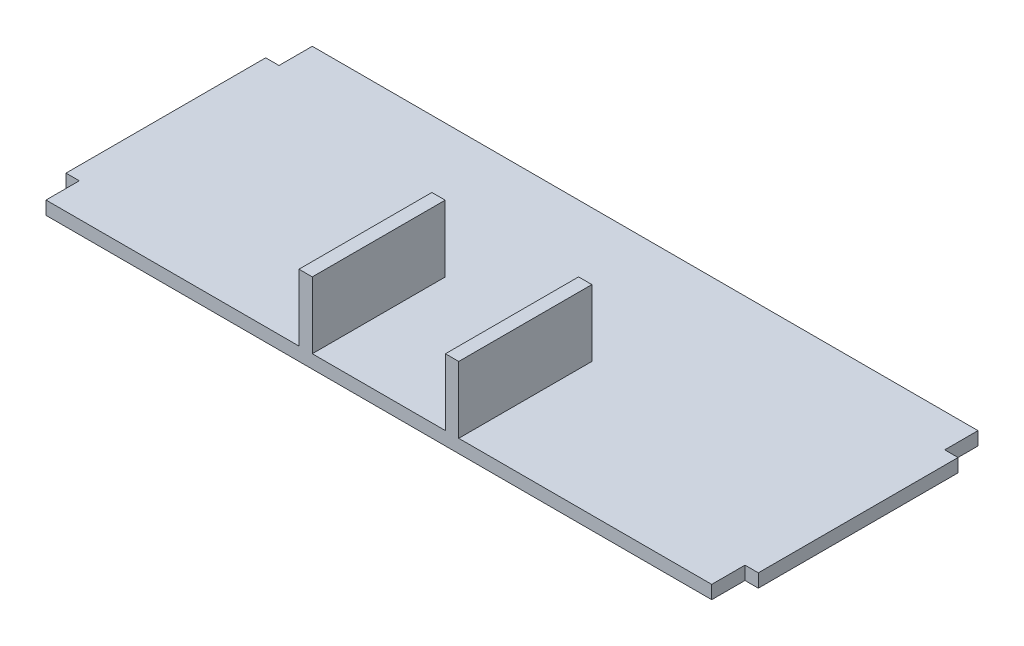
ISO-10303-21;
HEADER;
FILE_DESCRIPTION(('STEP AP214'),'2;1');
FILE_NAME('part.step','',(''),(''),'','','');
FILE_SCHEMA(('AUTOMOTIVE_DESIGN { 1 0 10303 214 1 1 1 1 }'));
ENDSEC;
DATA;
#1=APPLICATION_CONTEXT('core data for automotive mechanical design processes');
#2=APPLICATION_PROTOCOL_DEFINITION('international standard','automotive_design',2000,#1);
#3=PRODUCT_CONTEXT('',#1,'mechanical');
#4=PRODUCT('Part','Part','',(#3));
#5=PRODUCT_RELATED_PRODUCT_CATEGORY('part','',(#4));
#6=PRODUCT_DEFINITION_FORMATION('','',#4);
#7=PRODUCT_DEFINITION_CONTEXT('part definition',#1,'design');
#8=PRODUCT_DEFINITION('design','',#6,#7);
#9=PRODUCT_DEFINITION_SHAPE('','',#8);
#10=(LENGTH_UNIT() NAMED_UNIT(*) SI_UNIT(.MILLI.,.METRE.));
#11=(NAMED_UNIT(*) PLANE_ANGLE_UNIT() SI_UNIT($,.RADIAN.));
#12=(NAMED_UNIT(*) SI_UNIT($,.STERADIAN.) SOLID_ANGLE_UNIT());
#13=UNCERTAINTY_MEASURE_WITH_UNIT(LENGTH_MEASURE(1.E-05),#10,'distance_accuracy_value','');
#14=(GEOMETRIC_REPRESENTATION_CONTEXT(3) GLOBAL_UNCERTAINTY_ASSIGNED_CONTEXT((#13)) GLOBAL_UNIT_ASSIGNED_CONTEXT((#10,
#11,#12)) REPRESENTATION_CONTEXT('',''));
#15=CARTESIAN_POINT('',(0.,0.,0.));
#16=DIRECTION('',(0.,0.,1.));
#17=DIRECTION('',(1.,0.,0.));
#18=AXIS2_PLACEMENT_3D('',#15,#16,#17);
#19=CARTESIAN_POINT('',(100.,2.,0.));
#20=DIRECTION('',(1.,0.,0.));
#21=DIRECTION('',(0.,0.,-1.));
#22=AXIS2_PLACEMENT_3D('',#19,#20,#21);
#23=PLANE('',#22);
#24=DIRECTION('',(0.,0.,1.));
#25=VECTOR('',#24,1.);
#26=CARTESIAN_POINT('',(100.,0.,0.));
#27=LINE('',#26,#25);
#28=CARTESIAN_POINT('',(100.,0.,-5.));
#29=VERTEX_POINT('',#28);
#30=CARTESIAN_POINT('',(100.,0.,0.));
#31=VERTEX_POINT('',#30);
#32=EDGE_CURVE('E276',#29,#31,#27,.T.);
#33=ORIENTED_EDGE('',*,*,#32,.F.);
#34=DIRECTION('',(0.,-1.,0.));
#35=VECTOR('',#34,1.);
#36=CARTESIAN_POINT('',(100.,2.,-5.));
#37=LINE('',#36,#35);
#38=CARTESIAN_POINT('',(100.,2.,-5.));
#39=VERTEX_POINT('',#38);
#40=EDGE_CURVE('E54',#39,#29,#37,.T.);
#41=ORIENTED_EDGE('',*,*,#40,.F.);
#42=DIRECTION('',(0.,0.,1.));
#43=VECTOR('',#42,1.);
#44=CARTESIAN_POINT('',(100.,2.,0.));
#45=LINE('',#44,#43);
#46=CARTESIAN_POINT('',(100.,2.,0.));
#47=VERTEX_POINT('',#46);
#48=EDGE_CURVE('E284',#39,#47,#45,.T.);
#49=ORIENTED_EDGE('',*,*,#48,.T.);
#50=DIRECTION('',(0.,-1.,0.));
#51=VECTOR('',#50,1.);
#52=CARTESIAN_POINT('',(100.,2.,0.));
#53=LINE('',#52,#51);
#54=EDGE_CURVE('E11',#47,#31,#53,.T.);
#55=ORIENTED_EDGE('',*,*,#54,.T.);
#56=EDGE_LOOP('',(#33,#41,#49,#55));
#57=FACE_BOUND('',#56,.T.);
#58=ADVANCED_FACE('F45',(#57),#23,.T.);
#59=CARTESIAN_POINT('',(0.,2.,-5.));
#60=DIRECTION('',(0.,0.,-1.));
#61=DIRECTION('',(-1.,0.,0.));
#62=AXIS2_PLACEMENT_3D('',#59,#60,#61);
#63=PLANE('',#62);
#64=DIRECTION('',(1.,0.,0.));
#65=VECTOR('',#64,1.);
#66=CARTESIAN_POINT('',(0.,0.,-5.));
#67=LINE('',#66,#65);
#68=CARTESIAN_POINT('',(102.,0.,-5.));
#69=VERTEX_POINT('',#68);
#70=EDGE_CURVE('E343',#29,#69,#67,.T.);
#71=ORIENTED_EDGE('',*,*,#70,.T.);
#72=DIRECTION('',(0.,-1.,0.));
#73=VECTOR('',#72,1.);
#74=CARTESIAN_POINT('',(102.,2.,-5.));
#75=LINE('',#74,#73);
#76=CARTESIAN_POINT('',(102.,2.,-5.));
#77=VERTEX_POINT('',#76);
#78=EDGE_CURVE('E421',#77,#69,#75,.T.);
#79=ORIENTED_EDGE('',*,*,#78,.F.);
#80=DIRECTION('',(1.,0.,0.));
#81=VECTOR('',#80,1.);
#82=CARTESIAN_POINT('',(0.,2.,-5.));
#83=LINE('',#82,#81);
#84=EDGE_CURVE('E290',#39,#77,#83,.T.);
#85=ORIENTED_EDGE('',*,*,#84,.F.);
#86=ORIENTED_EDGE('',*,*,#40,.T.);
#87=EDGE_LOOP('',(#71,#79,#85,#86));
#88=FACE_BOUND('',#87,.T.);
#89=ADVANCED_FACE('F47',(#88),#63,.F.);
#90=CARTESIAN_POINT('',(102.,2.,0.));
#91=DIRECTION('',(1.,0.,0.));
#92=DIRECTION('',(0.,0.,-1.));
#93=AXIS2_PLACEMENT_3D('',#90,#91,#92);
#94=PLANE('',#93);
#95=DIRECTION('',(0.,0.,1.));
#96=VECTOR('',#95,1.);
#97=CARTESIAN_POINT('',(102.,0.,0.));
#98=LINE('',#97,#96);
#99=CARTESIAN_POINT('',(102.,0.,-35.));
#100=VERTEX_POINT('',#99);
#101=EDGE_CURVE('E348',#100,#69,#98,.T.);
#102=ORIENTED_EDGE('',*,*,#101,.F.);
#103=DIRECTION('',(0.,-1.,0.));
#104=VECTOR('',#103,1.);
#105=CARTESIAN_POINT('',(102.,2.,-35.));
#106=LINE('',#105,#104);
#107=CARTESIAN_POINT('',(102.,2.,-35.));
#108=VERTEX_POINT('',#107);
#109=EDGE_CURVE('E418',#108,#100,#106,.T.);
#110=ORIENTED_EDGE('',*,*,#109,.F.);
#111=DIRECTION('',(0.,0.,1.));
#112=VECTOR('',#111,1.);
#113=CARTESIAN_POINT('',(102.,2.,0.));
#114=LINE('',#113,#112);
#115=EDGE_CURVE('E294',#108,#77,#114,.T.);
#116=ORIENTED_EDGE('',*,*,#115,.T.);
#117=ORIENTED_EDGE('',*,*,#78,.T.);
#118=EDGE_LOOP('',(#102,#110,#116,#117));
#119=FACE_BOUND('',#118,.T.);
#120=ADVANCED_FACE('F524',(#119),#94,.T.);
#121=CARTESIAN_POINT('',(0.,2.,-35.));
#122=DIRECTION('',(0.,0.,-1.));
#123=DIRECTION('',(-1.,0.,0.));
#124=AXIS2_PLACEMENT_3D('',#121,#122,#123);
#125=PLANE('',#124);
#126=DIRECTION('',(1.,0.,0.));
#127=VECTOR('',#126,1.);
#128=CARTESIAN_POINT('',(0.,0.,-35.));
#129=LINE('',#128,#127);
#130=CARTESIAN_POINT('',(100.,0.,-35.));
#131=VERTEX_POINT('',#130);
#132=EDGE_CURVE('E352',#131,#100,#129,.T.);
#133=ORIENTED_EDGE('',*,*,#132,.F.);
#134=DIRECTION('',(0.,-1.,0.));
#135=VECTOR('',#134,1.);
#136=CARTESIAN_POINT('',(100.,2.,-35.));
#137=LINE('',#136,#135);
#138=CARTESIAN_POINT('',(100.,2.,-35.));
#139=VERTEX_POINT('',#138);
#140=EDGE_CURVE('E415',#139,#131,#137,.T.);
#141=ORIENTED_EDGE('',*,*,#140,.F.);
#142=DIRECTION('',(1.,0.,0.));
#143=VECTOR('',#142,1.);
#144=CARTESIAN_POINT('',(0.,2.,-35.));
#145=LINE('',#144,#143);
#146=EDGE_CURVE('E298',#139,#108,#145,.T.);
#147=ORIENTED_EDGE('',*,*,#146,.T.);
#148=ORIENTED_EDGE('',*,*,#109,.T.);
#149=EDGE_LOOP('',(#133,#141,#147,#148));
#150=FACE_BOUND('',#149,.T.);
#151=ADVANCED_FACE('F526',(#150),#125,.T.);
#152=CARTESIAN_POINT('',(100.,0.,-40.));
#153=VERTEX_POINT('',#152);
#154=EDGE_CURVE('E344',#153,#131,#27,.T.);
#155=ORIENTED_EDGE('',*,*,#154,.F.);
#156=DIRECTION('',(0.,-1.,0.));
#157=VECTOR('',#156,1.);
#158=CARTESIAN_POINT('',(100.,2.,-40.));
#159=LINE('',#158,#157);
#160=CARTESIAN_POINT('',(100.,2.,-40.));
#161=VERTEX_POINT('',#160);
#162=EDGE_CURVE('E412',#161,#153,#159,.T.);
#163=ORIENTED_EDGE('',*,*,#162,.F.);
#164=EDGE_CURVE('E291',#161,#139,#45,.T.);
#165=ORIENTED_EDGE('',*,*,#164,.T.);
#166=ORIENTED_EDGE('',*,*,#140,.T.);
#167=EDGE_LOOP('',(#155,#163,#165,#166));
#168=FACE_BOUND('',#167,.T.);
#169=ADVANCED_FACE('F496',(#168),#23,.T.);
#170=CARTESIAN_POINT('',(0.,2.,-40.));
#171=DIRECTION('',(0.,0.,-1.));
#172=DIRECTION('',(-1.,0.,0.));
#173=AXIS2_PLACEMENT_3D('',#170,#171,#172);
#174=PLANE('',#173);
#175=DIRECTION('',(1.,0.,0.));
#176=VECTOR('',#175,1.);
#177=CARTESIAN_POINT('',(0.,0.,-40.));
#178=LINE('',#177,#176);
#179=CARTESIAN_POINT('',(0.,0.,-40.));
#180=VERTEX_POINT('',#179);
#181=EDGE_CURVE('E356',#180,#153,#178,.T.);
#182=ORIENTED_EDGE('',*,*,#181,.F.);
#183=DIRECTION('',(0.,-1.,0.));
#184=VECTOR('',#183,1.);
#185=CARTESIAN_POINT('',(0.,2.,-40.));
#186=LINE('',#185,#184);
#187=CARTESIAN_POINT('',(0.,2.,-40.));
#188=VERTEX_POINT('',#187);
#189=EDGE_CURVE('E409',#188,#180,#186,.T.);
#190=ORIENTED_EDGE('',*,*,#189,.F.);
#191=DIRECTION('',(1.,0.,0.));
#192=VECTOR('',#191,1.);
#193=CARTESIAN_POINT('',(0.,2.,-40.));
#194=LINE('',#193,#192);
#195=EDGE_CURVE('E302',#188,#161,#194,.T.);
#196=ORIENTED_EDGE('',*,*,#195,.T.);
#197=ORIENTED_EDGE('',*,*,#162,.T.);
#198=EDGE_LOOP('',(#182,#190,#196,#197));
#199=FACE_BOUND('',#198,.T.);
#200=ADVANCED_FACE('F503',(#199),#174,.T.);
#201=CARTESIAN_POINT('',(0.,2.,0.));
#202=DIRECTION('',(1.,0.,0.));
#203=DIRECTION('',(0.,0.,-1.));
#204=AXIS2_PLACEMENT_3D('',#201,#202,#203);
#205=PLANE('',#204);
#206=DIRECTION('',(0.,0.,1.));
#207=VECTOR('',#206,1.);
#208=CARTESIAN_POINT('',(0.,0.,0.));
#209=LINE('',#208,#207);
#210=CARTESIAN_POINT('',(0.,0.,-35.));
#211=VERTEX_POINT('',#210);
#212=EDGE_CURVE('E360',#180,#211,#209,.T.);
#213=ORIENTED_EDGE('',*,*,#212,.T.);
#214=DIRECTION('',(0.,-1.,0.));
#215=VECTOR('',#214,1.);
#216=CARTESIAN_POINT('',(0.,2.,-35.));
#217=LINE('',#216,#215);
#218=CARTESIAN_POINT('',(0.,2.,-35.));
#219=VERTEX_POINT('',#218);
#220=EDGE_CURVE('E406',#219,#211,#217,.T.);
#221=ORIENTED_EDGE('',*,*,#220,.F.);
#222=DIRECTION('',(0.,0.,1.));
#223=VECTOR('',#222,1.);
#224=CARTESIAN_POINT('',(0.,2.,0.));
#225=LINE('',#224,#223);
#226=EDGE_CURVE('E306',#188,#219,#225,.T.);
#227=ORIENTED_EDGE('',*,*,#226,.F.);
#228=ORIENTED_EDGE('',*,*,#189,.T.);
#229=EDGE_LOOP('',(#213,#221,#227,#228));
#230=FACE_BOUND('',#229,.T.);
#231=ADVANCED_FACE('F508',(#230),#205,.F.);
#232=CARTESIAN_POINT('',(0.,2.,-35.));
#233=DIRECTION('',(0.,0.,-1.));
#234=DIRECTION('',(-1.,0.,0.));
#235=AXIS2_PLACEMENT_3D('',#232,#233,#234);
#236=PLANE('',#235);
#237=DIRECTION('',(1.,0.,0.));
#238=VECTOR('',#237,1.);
#239=CARTESIAN_POINT('',(0.,0.,-35.));
#240=LINE('',#239,#238);
#241=CARTESIAN_POINT('',(-2.,0.,-35.));
#242=VERTEX_POINT('',#241);
#243=EDGE_CURVE('E364',#242,#211,#240,.T.);
#244=ORIENTED_EDGE('',*,*,#243,.F.);
#245=DIRECTION('',(0.,-1.,0.));
#246=VECTOR('',#245,1.);
#247=CARTESIAN_POINT('',(-2.,2.,-35.));
#248=LINE('',#247,#246);
#249=CARTESIAN_POINT('',(-2.,2.,-35.));
#250=VERTEX_POINT('',#249);
#251=EDGE_CURVE('E403',#250,#242,#248,.T.);
#252=ORIENTED_EDGE('',*,*,#251,.F.);
#253=DIRECTION('',(1.,0.,0.));
#254=VECTOR('',#253,1.);
#255=CARTESIAN_POINT('',(0.,2.,-35.));
#256=LINE('',#255,#254);
#257=EDGE_CURVE('E309',#250,#219,#256,.T.);
#258=ORIENTED_EDGE('',*,*,#257,.T.);
#259=ORIENTED_EDGE('',*,*,#220,.T.);
#260=EDGE_LOOP('',(#244,#252,#258,#259));
#261=FACE_BOUND('',#260,.T.);
#262=ADVANCED_FACE('F514',(#261),#236,.T.);
#263=CARTESIAN_POINT('',(-2.,2.,0.));
#264=DIRECTION('',(1.,0.,0.));
#265=DIRECTION('',(0.,0.,-1.));
#266=AXIS2_PLACEMENT_3D('',#263,#264,#265);
#267=PLANE('',#266);
#268=DIRECTION('',(0.,0.,1.));
#269=VECTOR('',#268,1.);
#270=CARTESIAN_POINT('',(-2.,0.,0.));
#271=LINE('',#270,#269);
#272=CARTESIAN_POINT('',(-2.,0.,-5.));
#273=VERTEX_POINT('',#272);
#274=EDGE_CURVE('E369',#242,#273,#271,.T.);
#275=ORIENTED_EDGE('',*,*,#274,.T.);
#276=DIRECTION('',(0.,-1.,0.));
#277=VECTOR('',#276,1.);
#278=CARTESIAN_POINT('',(-2.,2.,-5.));
#279=LINE('',#278,#277);
#280=CARTESIAN_POINT('',(-2.,2.,-5.));
#281=VERTEX_POINT('',#280);
#282=EDGE_CURVE('E399',#281,#273,#279,.T.);
#283=ORIENTED_EDGE('',*,*,#282,.F.);
#284=DIRECTION('',(0.,0.,1.));
#285=VECTOR('',#284,1.);
#286=CARTESIAN_POINT('',(-2.,2.,0.));
#287=LINE('',#286,#285);
#288=EDGE_CURVE('E314',#250,#281,#287,.T.);
#289=ORIENTED_EDGE('',*,*,#288,.F.);
#290=ORIENTED_EDGE('',*,*,#251,.T.);
#291=EDGE_LOOP('',(#275,#283,#289,#290));
#292=FACE_BOUND('',#291,.T.);
#293=ADVANCED_FACE('F517',(#292),#267,.F.);
#294=CARTESIAN_POINT('',(0.,2.,-5.));
#295=DIRECTION('',(0.,0.,-1.));
#296=DIRECTION('',(-1.,0.,0.));
#297=AXIS2_PLACEMENT_3D('',#294,#295,#296);
#298=PLANE('',#297);
#299=DIRECTION('',(1.,0.,0.));
#300=VECTOR('',#299,1.);
#301=CARTESIAN_POINT('',(0.,0.,-5.));
#302=LINE('',#301,#300);
#303=CARTESIAN_POINT('',(0.,0.,-5.));
#304=VERTEX_POINT('',#303);
#305=EDGE_CURVE('E372',#273,#304,#302,.T.);
#306=ORIENTED_EDGE('',*,*,#305,.T.);
#307=DIRECTION('',(0.,-1.,0.));
#308=VECTOR('',#307,1.);
#309=CARTESIAN_POINT('',(0.,2.,-5.));
#310=LINE('',#309,#308);
#311=CARTESIAN_POINT('',(0.,2.,-5.));
#312=VERTEX_POINT('',#311);
#313=EDGE_CURVE('E395',#312,#304,#310,.T.);
#314=ORIENTED_EDGE('',*,*,#313,.F.);
#315=DIRECTION('',(1.,0.,0.));
#316=VECTOR('',#315,1.);
#317=CARTESIAN_POINT('',(0.,2.,-5.));
#318=LINE('',#317,#316);
#319=EDGE_CURVE('E317',#281,#312,#318,.T.);
#320=ORIENTED_EDGE('',*,*,#319,.F.);
#321=ORIENTED_EDGE('',*,*,#282,.T.);
#322=EDGE_LOOP('',(#306,#314,#320,#321));
#323=FACE_BOUND('',#322,.T.);
#324=ADVANCED_FACE('F520',(#323),#298,.F.);
#325=CARTESIAN_POINT('',(0.,0.,0.));
#326=VERTEX_POINT('',#325);
#327=EDGE_CURVE('E365',#304,#326,#209,.T.);
#328=ORIENTED_EDGE('',*,*,#327,.T.);
#329=DIRECTION('',(0.,-1.,0.));
#330=VECTOR('',#329,1.);
#331=CARTESIAN_POINT('',(0.,2.,0.));
#332=LINE('',#331,#330);
#333=CARTESIAN_POINT('',(0.,2.,0.));
#334=VERTEX_POINT('',#333);
#335=EDGE_CURVE('E391',#334,#326,#332,.T.);
#336=ORIENTED_EDGE('',*,*,#335,.F.);
#337=EDGE_CURVE('E310',#312,#334,#225,.T.);
#338=ORIENTED_EDGE('',*,*,#337,.F.);
#339=ORIENTED_EDGE('',*,*,#313,.T.);
#340=EDGE_LOOP('',(#328,#336,#338,#339));
#341=FACE_BOUND('',#340,.T.);
#342=ADVANCED_FACE('F446',(#341),#205,.F.);
#343=CARTESIAN_POINT('',(38.,2.,0.));
#344=DIRECTION('',(-1.,0.,0.));
#345=DIRECTION('',(0.,0.,1.));
#346=AXIS2_PLACEMENT_3D('',#343,#344,#345);
#347=PLANE('',#346);
#348=DIRECTION('',(0.,0.,-1.));
#349=VECTOR('',#348,1.);
#350=CARTESIAN_POINT('',(38.,2.,0.));
#351=LINE('',#350,#349);
#352=CARTESIAN_POINT('',(38.,2.,-19.9635691816707));
#353=VERTEX_POINT('',#352);
#354=CARTESIAN_POINT('',(38.,2.,-20.));
#355=VERTEX_POINT('',#354);
#356=EDGE_CURVE('E61',#353,#355,#351,.T.);
#357=ORIENTED_EDGE('',*,*,#356,.F.);
#358=DIRECTION('',(0.,-1.,0.));
#359=VECTOR('',#358,1.);
#360=CARTESIAN_POINT('',(38.,12.,-19.9635691816707));
#361=LINE('',#360,#359);
#362=CARTESIAN_POINT('',(38.,0.,-19.9635691816707));
#363=VERTEX_POINT('',#362);
#364=EDGE_CURVE('E271',#353,#363,#361,.T.);
#365=ORIENTED_EDGE('',*,*,#364,.T.);
#366=DIRECTION('',(0.,0.,-1.));
#367=VECTOR('',#366,1.);
#368=CARTESIAN_POINT('',(38.,0.,0.));
#369=LINE('',#368,#367);
#370=CARTESIAN_POINT('',(38.,0.,-20.));
#371=VERTEX_POINT('',#370);
#372=EDGE_CURVE('E375',#363,#371,#369,.T.);
#373=ORIENTED_EDGE('',*,*,#372,.T.);
#374=DIRECTION('',(0.,-1.,0.));
#375=VECTOR('',#374,1.);
#376=CARTESIAN_POINT('',(38.,2.,-20.));
#377=LINE('',#376,#375);
#378=EDGE_CURVE('E387',#355,#371,#377,.T.);
#379=ORIENTED_EDGE('',*,*,#378,.F.);
#380=EDGE_LOOP('',(#357,#365,#373,#379));
#381=FACE_BOUND('',#380,.T.);
#382=ADVANCED_FACE('F468',(#381),#347,.F.);
#383=CARTESIAN_POINT('',(0.,2.,-20.));
#384=DIRECTION('',(0.,0.,-1.));
#385=DIRECTION('',(-1.,0.,0.));
#386=AXIS2_PLACEMENT_3D('',#383,#384,#385);
#387=PLANE('',#386);
#388=DIRECTION('',(1.,0.,0.));
#389=VECTOR('',#388,1.);
#390=CARTESIAN_POINT('',(0.,0.,-20.));
#391=LINE('',#390,#389);
#392=CARTESIAN_POINT('',(40.,0.,-20.));
#393=VERTEX_POINT('',#392);
#394=EDGE_CURVE('E378',#371,#393,#391,.T.);
#395=ORIENTED_EDGE('',*,*,#394,.T.);
#396=DIRECTION('',(0.,-1.,0.));
#397=VECTOR('',#396,1.);
#398=CARTESIAN_POINT('',(40.,2.,-20.));
#399=LINE('',#398,#397);
#400=CARTESIAN_POINT('',(40.,2.,-20.));
#401=VERTEX_POINT('',#400);
#402=EDGE_CURVE('E336',#401,#393,#399,.T.);
#403=ORIENTED_EDGE('',*,*,#402,.F.);
#404=DIRECTION('',(1.,0.,0.));
#405=VECTOR('',#404,1.);
#406=CARTESIAN_POINT('',(0.,2.,-20.));
#407=LINE('',#406,#405);
#408=EDGE_CURVE('E323',#355,#401,#407,.T.);
#409=ORIENTED_EDGE('',*,*,#408,.F.);
#410=ORIENTED_EDGE('',*,*,#378,.T.);
#411=EDGE_LOOP('',(#395,#403,#409,#410));
#412=FACE_BOUND('',#411,.T.);
#413=ADVANCED_FACE('F466',(#412),#387,.F.);
#414=CARTESIAN_POINT('',(40.,2.,0.));
#415=DIRECTION('',(-1.,0.,0.));
#416=DIRECTION('',(0.,0.,1.));
#417=AXIS2_PLACEMENT_3D('',#414,#415,#416);
#418=PLANE('',#417);
#419=DIRECTION('',(0.,-1.,0.));
#420=VECTOR('',#419,1.);
#421=CARTESIAN_POINT('',(40.,12.,-19.9635691816707));
#422=LINE('',#421,#420);
#423=CARTESIAN_POINT('',(40.,2.,-19.9635691816707));
#424=VERTEX_POINT('',#423);
#425=CARTESIAN_POINT('',(40.,0.,-19.9635691816707));
#426=VERTEX_POINT('',#425);
#427=EDGE_CURVE('E257',#424,#426,#422,.T.);
#428=ORIENTED_EDGE('',*,*,#427,.F.);
#429=DIRECTION('',(0.,0.,-1.));
#430=VECTOR('',#429,1.);
#431=CARTESIAN_POINT('',(40.,2.,0.));
#432=LINE('',#431,#430);
#433=EDGE_CURVE('E327',#424,#401,#432,.T.);
#434=ORIENTED_EDGE('',*,*,#433,.T.);
#435=ORIENTED_EDGE('',*,*,#402,.T.);
#436=DIRECTION('',(0.,0.,-1.));
#437=VECTOR('',#436,1.);
#438=CARTESIAN_POINT('',(40.,0.,0.));
#439=LINE('',#438,#437);
#440=EDGE_CURVE('E339',#426,#393,#439,.T.);
#441=ORIENTED_EDGE('',*,*,#440,.F.);
#442=EDGE_LOOP('',(#428,#434,#435,#441));
#443=FACE_BOUND('',#442,.T.);
#444=ADVANCED_FACE('F462',(#443),#418,.T.);
#445=CARTESIAN_POINT('',(0.,2.,0.));
#446=DIRECTION('',(0.,0.,-1.));
#447=DIRECTION('',(-1.,0.,0.));
#448=AXIS2_PLACEMENT_3D('',#445,#446,#447);
#449=PLANE('',#448);
#450=DIRECTION('',(1.,0.,0.));
#451=VECTOR('',#450,1.);
#452=CARTESIAN_POINT('',(0.,0.,0.));
#453=LINE('',#452,#451);
#454=EDGE_CURVE('E281',#326,#31,#453,.T.);
#455=ORIENTED_EDGE('',*,*,#454,.T.);
#456=ORIENTED_EDGE('',*,*,#54,.F.);
#457=DIRECTION('',(1.,0.,0.));
#458=VECTOR('',#457,1.);
#459=CARTESIAN_POINT('',(0.,2.,0.));
#460=LINE('',#459,#458);
#461=CARTESIAN_POINT('',(62.,2.,0.));
#462=VERTEX_POINT('',#461);
#463=EDGE_CURVE('E280',#462,#47,#460,.T.);
#464=ORIENTED_EDGE('',*,*,#463,.F.);
#465=DIRECTION('',(0.,-1.,0.));
#466=VECTOR('',#465,1.);
#467=CARTESIAN_POINT('',(62.,12.,0.));
#468=LINE('',#467,#466);
#469=CARTESIAN_POINT('',(62.,12.,0.));
#470=VERTEX_POINT('',#469);
#471=EDGE_CURVE('E238',#470,#462,#468,.T.);
#472=ORIENTED_EDGE('',*,*,#471,.F.);
#473=DIRECTION('',(1.,0.,0.));
#474=VECTOR('',#473,1.);
#475=CARTESIAN_POINT('',(0.,12.,0.));
#476=LINE('',#475,#474);
#477=CARTESIAN_POINT('',(60.,12.,0.));
#478=VERTEX_POINT('',#477);
#479=EDGE_CURVE('E228',#478,#470,#476,.T.);
#480=ORIENTED_EDGE('',*,*,#479,.F.);
#481=DIRECTION('',(0.,-1.,0.));
#482=VECTOR('',#481,1.);
#483=CARTESIAN_POINT('',(60.,12.,0.));
#484=LINE('',#483,#482);
#485=CARTESIAN_POINT('',(60.,2.,0.));
#486=VERTEX_POINT('',#485);
#487=EDGE_CURVE('E213',#478,#486,#484,.T.);
#488=ORIENTED_EDGE('',*,*,#487,.T.);
#489=CARTESIAN_POINT('',(40.,2.,0.));
#490=VERTEX_POINT('',#489);
#491=EDGE_CURVE('E285',#490,#486,#460,.T.);
#492=ORIENTED_EDGE('',*,*,#491,.F.);
#493=DIRECTION('',(0.,-1.,0.));
#494=VECTOR('',#493,1.);
#495=CARTESIAN_POINT('',(40.,12.,0.));
#496=LINE('',#495,#494);
#497=CARTESIAN_POINT('',(40.,12.,0.));
#498=VERTEX_POINT('',#497);
#499=EDGE_CURVE('E264',#498,#490,#496,.T.);
#500=ORIENTED_EDGE('',*,*,#499,.F.);
#501=DIRECTION('',(1.,0.,0.));
#502=VECTOR('',#501,1.);
#503=CARTESIAN_POINT('',(0.,12.,0.));
#504=LINE('',#503,#502);
#505=CARTESIAN_POINT('',(38.,12.,0.));
#506=VERTEX_POINT('',#505);
#507=EDGE_CURVE('E251',#506,#498,#504,.T.);
#508=ORIENTED_EDGE('',*,*,#507,.F.);
#509=DIRECTION('',(0.,-1.,0.));
#510=VECTOR('',#509,1.);
#511=CARTESIAN_POINT('',(38.,12.,0.));
#512=LINE('',#511,#510);
#513=CARTESIAN_POINT('',(38.,2.,0.));
#514=VERTEX_POINT('',#513);
#515=EDGE_CURVE('E267',#506,#514,#512,.T.);
#516=ORIENTED_EDGE('',*,*,#515,.T.);
#517=EDGE_CURVE('E286',#334,#514,#460,.T.);
#518=ORIENTED_EDGE('',*,*,#517,.F.);
#519=ORIENTED_EDGE('',*,*,#335,.T.);
#520=EDGE_LOOP('',(#455,#456,#464,#472,#480,#488,#492,#500,#508,#516,#518,#519));
#521=FACE_BOUND('',#520,.T.);
#522=ADVANCED_FACE('F437',(#521),#449,.F.);
#523=CARTESIAN_POINT('',(0.,2.,0.));
#524=DIRECTION('',(0.,1.,0.));
#525=DIRECTION('',(0.,0.,1.));
#526=AXIS2_PLACEMENT_3D('',#523,#524,#525);
#527=PLANE('',#526);
#528=DIRECTION('',(0.,0.,-1.));
#529=VECTOR('',#528,1.);
#530=CARTESIAN_POINT('',(62.,2.,0.));
#531=LINE('',#530,#529);
#532=CARTESIAN_POINT('',(62.,2.,-20.));
#533=VERTEX_POINT('',#532);
#534=EDGE_CURVE('E277',#462,#533,#531,.T.);
#535=ORIENTED_EDGE('',*,*,#534,.F.);
#536=ORIENTED_EDGE('',*,*,#463,.T.);
#537=ORIENTED_EDGE('',*,*,#48,.F.);
#538=ORIENTED_EDGE('',*,*,#84,.T.);
#539=ORIENTED_EDGE('',*,*,#115,.F.);
#540=ORIENTED_EDGE('',*,*,#146,.F.);
#541=ORIENTED_EDGE('',*,*,#164,.F.);
#542=ORIENTED_EDGE('',*,*,#195,.F.);
#543=ORIENTED_EDGE('',*,*,#226,.T.);
#544=ORIENTED_EDGE('',*,*,#257,.F.);
#545=ORIENTED_EDGE('',*,*,#288,.T.);
#546=ORIENTED_EDGE('',*,*,#319,.T.);
#547=ORIENTED_EDGE('',*,*,#337,.T.);
#548=ORIENTED_EDGE('',*,*,#517,.T.);
#549=EDGE_CURVE('E320',#514,#353,#351,.T.);
#550=ORIENTED_EDGE('',*,*,#549,.T.);
#551=ORIENTED_EDGE('',*,*,#356,.T.);
#552=ORIENTED_EDGE('',*,*,#408,.T.);
#553=ORIENTED_EDGE('',*,*,#433,.F.);
#554=EDGE_CURVE('E328',#490,#424,#432,.T.);
#555=ORIENTED_EDGE('',*,*,#554,.F.);
#556=ORIENTED_EDGE('',*,*,#491,.T.);
#557=DIRECTION('',(0.,0.,-1.));
#558=VECTOR('',#557,1.);
#559=CARTESIAN_POINT('',(60.,2.,0.));
#560=LINE('',#559,#558);
#561=CARTESIAN_POINT('',(60.,2.,-20.));
#562=VERTEX_POINT('',#561);
#563=EDGE_CURVE('E331',#486,#562,#560,.T.);
#564=ORIENTED_EDGE('',*,*,#563,.T.);
#565=DIRECTION('',(1.,0.,0.));
#566=VECTOR('',#565,1.);
#567=CARTESIAN_POINT('',(0.,2.,-20.));
#568=LINE('',#567,#566);
#569=EDGE_CURVE('E208',#562,#533,#568,.T.);
#570=ORIENTED_EDGE('',*,*,#569,.T.);
#571=EDGE_LOOP('',(#535,#536,#537,#538,#539,#540,#541,#542,#543,#544,#545,#546,#547,#548,#550,
#551,#552,#553,#555,#556,#564,#570));
#572=FACE_BOUND('',#571,.T.);
#573=ADVANCED_FACE('F485',(#572),#527,.T.);
#574=CARTESIAN_POINT('',(0.,0.,0.));
#575=DIRECTION('',(0.,1.,0.));
#576=DIRECTION('',(0.,0.,1.));
#577=AXIS2_PLACEMENT_3D('',#574,#575,#576);
#578=PLANE('',#577);
#579=ORIENTED_EDGE('',*,*,#372,.F.);
#580=DIRECTION('',(1.,0.,0.));
#581=VECTOR('',#580,1.);
#582=CARTESIAN_POINT('',(0.,0.,-19.9635691816707));
#583=LINE('',#582,#581);
#584=EDGE_CURVE('E69',#363,#426,#583,.T.);
#585=ORIENTED_EDGE('',*,*,#584,.T.);
#586=ORIENTED_EDGE('',*,*,#440,.T.);
#587=ORIENTED_EDGE('',*,*,#394,.F.);
#588=EDGE_LOOP('',(#579,#585,#586,#587));
#589=FACE_BOUND('',#588,.T.);
#590=ORIENTED_EDGE('',*,*,#32,.T.);
#591=ORIENTED_EDGE('',*,*,#454,.F.);
#592=ORIENTED_EDGE('',*,*,#327,.F.);
#593=ORIENTED_EDGE('',*,*,#305,.F.);
#594=ORIENTED_EDGE('',*,*,#274,.F.);
#595=ORIENTED_EDGE('',*,*,#243,.T.);
#596=ORIENTED_EDGE('',*,*,#212,.F.);
#597=ORIENTED_EDGE('',*,*,#181,.T.);
#598=ORIENTED_EDGE('',*,*,#154,.T.);
#599=ORIENTED_EDGE('',*,*,#132,.T.);
#600=ORIENTED_EDGE('',*,*,#101,.T.);
#601=ORIENTED_EDGE('',*,*,#70,.F.);
#602=EDGE_LOOP('',(#590,#591,#592,#593,#594,#595,#596,#597,#598,#599,#600,#601));
#603=FACE_BOUND('',#602,.T.);
#604=ADVANCED_FACE('F432',(#589,#603),#578,.F.);
#605=CARTESIAN_POINT('',(0.,12.,-19.9635691816707));
#606=DIRECTION('',(0.,0.,-1.));
#607=DIRECTION('',(-1.,0.,0.));
#608=AXIS2_PLACEMENT_3D('',#605,#606,#607);
#609=PLANE('',#608);
#610=ORIENTED_EDGE('',*,*,#584,.F.);
#611=ORIENTED_EDGE('',*,*,#364,.F.);
#612=CARTESIAN_POINT('',(38.,12.,-19.9635691816707));
#613=VERTEX_POINT('',#612);
#614=EDGE_CURVE('E272',#613,#353,#361,.T.);
#615=ORIENTED_EDGE('',*,*,#614,.F.);
#616=DIRECTION('',(1.,0.,0.));
#617=VECTOR('',#616,1.);
#618=CARTESIAN_POINT('',(0.,12.,-19.9635691816707));
#619=LINE('',#618,#617);
#620=CARTESIAN_POINT('',(40.,12.,-19.9635691816707));
#621=VERTEX_POINT('',#620);
#622=EDGE_CURVE('E243',#613,#621,#619,.T.);
#623=ORIENTED_EDGE('',*,*,#622,.T.);
#624=EDGE_CURVE('E260',#621,#424,#422,.T.);
#625=ORIENTED_EDGE('',*,*,#624,.T.);
#626=ORIENTED_EDGE('',*,*,#427,.T.);
#627=EDGE_LOOP('',(#610,#611,#615,#623,#625,#626));
#628=FACE_BOUND('',#627,.T.);
#629=ADVANCED_FACE('F457',(#628),#609,.T.);
#630=CARTESIAN_POINT('',(38.,12.,0.));
#631=DIRECTION('',(-1.,0.,0.));
#632=DIRECTION('',(0.,0.,1.));
#633=AXIS2_PLACEMENT_3D('',#630,#631,#632);
#634=PLANE('',#633);
#635=ORIENTED_EDGE('',*,*,#614,.T.);
#636=ORIENTED_EDGE('',*,*,#549,.F.);
#637=ORIENTED_EDGE('',*,*,#515,.F.);
#638=DIRECTION('',(0.,0.,-1.));
#639=VECTOR('',#638,1.);
#640=CARTESIAN_POINT('',(38.,12.,0.));
#641=LINE('',#640,#639);
#642=EDGE_CURVE('E247',#506,#613,#641,.T.);
#643=ORIENTED_EDGE('',*,*,#642,.T.);
#644=EDGE_LOOP('',(#635,#636,#637,#643));
#645=FACE_BOUND('',#644,.T.);
#646=ADVANCED_FACE('F472',(#645),#634,.T.);
#647=CARTESIAN_POINT('',(40.,12.,0.));
#648=DIRECTION('',(-1.,0.,0.));
#649=DIRECTION('',(0.,0.,1.));
#650=AXIS2_PLACEMENT_3D('',#647,#648,#649);
#651=PLANE('',#650);
#652=ORIENTED_EDGE('',*,*,#554,.T.);
#653=ORIENTED_EDGE('',*,*,#624,.F.);
#654=DIRECTION('',(0.,0.,-1.));
#655=VECTOR('',#654,1.);
#656=CARTESIAN_POINT('',(40.,12.,0.));
#657=LINE('',#656,#655);
#658=EDGE_CURVE('E254',#498,#621,#657,.T.);
#659=ORIENTED_EDGE('',*,*,#658,.F.);
#660=ORIENTED_EDGE('',*,*,#499,.T.);
#661=EDGE_LOOP('',(#652,#653,#659,#660));
#662=FACE_BOUND('',#661,.T.);
#663=ADVANCED_FACE('F480',(#662),#651,.F.);
#664=CARTESIAN_POINT('',(0.,12.,0.));
#665=DIRECTION('',(0.,1.,0.));
#666=DIRECTION('',(0.,0.,1.));
#667=AXIS2_PLACEMENT_3D('',#664,#665,#666);
#668=PLANE('',#667);
#669=ORIENTED_EDGE('',*,*,#622,.F.);
#670=ORIENTED_EDGE('',*,*,#642,.F.);
#671=ORIENTED_EDGE('',*,*,#507,.T.);
#672=ORIENTED_EDGE('',*,*,#658,.T.);
#673=EDGE_LOOP('',(#669,#670,#671,#672));
#674=FACE_BOUND('',#673,.T.);
#675=ADVANCED_FACE('F476',(#674),#668,.T.);
#676=CARTESIAN_POINT('',(0.,12.,-20.));
#677=DIRECTION('',(0.,0.,-1.));
#678=DIRECTION('',(-1.,0.,0.));
#679=AXIS2_PLACEMENT_3D('',#676,#677,#678);
#680=PLANE('',#679);
#681=DIRECTION('',(0.,-1.,0.));
#682=VECTOR('',#681,1.);
#683=CARTESIAN_POINT('',(62.,12.,-20.));
#684=LINE('',#683,#682);
#685=CARTESIAN_POINT('',(62.,12.,-20.));
#686=VERTEX_POINT('',#685);
#687=EDGE_CURVE('E235',#686,#533,#684,.T.);
#688=ORIENTED_EDGE('',*,*,#687,.T.);
#689=ORIENTED_EDGE('',*,*,#569,.F.);
#690=DIRECTION('',(0.,-1.,0.));
#691=VECTOR('',#690,1.);
#692=CARTESIAN_POINT('',(60.,12.,-20.));
#693=LINE('',#692,#691);
#694=CARTESIAN_POINT('',(60.,12.,-20.));
#695=VERTEX_POINT('',#694);
#696=EDGE_CURVE('E202',#695,#562,#693,.T.);
#697=ORIENTED_EDGE('',*,*,#696,.F.);
#698=DIRECTION('',(1.,0.,0.));
#699=VECTOR('',#698,1.);
#700=CARTESIAN_POINT('',(0.,12.,-20.));
#701=LINE('',#700,#699);
#702=EDGE_CURVE('E206',#695,#686,#701,.T.);
#703=ORIENTED_EDGE('',*,*,#702,.T.);
#704=EDGE_LOOP('',(#688,#689,#697,#703));
#705=FACE_BOUND('',#704,.T.);
#706=ADVANCED_FACE('F205',(#705),#680,.T.);
#707=CARTESIAN_POINT('',(60.,12.,0.));
#708=DIRECTION('',(-1.,0.,0.));
#709=DIRECTION('',(0.,0.,1.));
#710=AXIS2_PLACEMENT_3D('',#707,#708,#709);
#711=PLANE('',#710);
#712=ORIENTED_EDGE('',*,*,#696,.T.);
#713=ORIENTED_EDGE('',*,*,#563,.F.);
#714=ORIENTED_EDGE('',*,*,#487,.F.);
#715=DIRECTION('',(0.,0.,-1.));
#716=VECTOR('',#715,1.);
#717=CARTESIAN_POINT('',(60.,12.,0.));
#718=LINE('',#717,#716);
#719=EDGE_CURVE('E218',#478,#695,#718,.T.);
#720=ORIENTED_EDGE('',*,*,#719,.T.);
#721=EDGE_LOOP('',(#712,#713,#714,#720));
#722=FACE_BOUND('',#721,.T.);
#723=ADVANCED_FACE('F224',(#722),#711,.T.);
#724=CARTESIAN_POINT('',(62.,12.,0.));
#725=DIRECTION('',(-1.,0.,0.));
#726=DIRECTION('',(0.,0.,1.));
#727=AXIS2_PLACEMENT_3D('',#724,#725,#726);
#728=PLANE('',#727);
#729=ORIENTED_EDGE('',*,*,#534,.T.);
#730=ORIENTED_EDGE('',*,*,#687,.F.);
#731=DIRECTION('',(0.,0.,-1.));
#732=VECTOR('',#731,1.);
#733=CARTESIAN_POINT('',(62.,12.,0.));
#734=LINE('',#733,#732);
#735=EDGE_CURVE('E220',#470,#686,#734,.T.);
#736=ORIENTED_EDGE('',*,*,#735,.F.);
#737=ORIENTED_EDGE('',*,*,#471,.T.);
#738=EDGE_LOOP('',(#729,#730,#736,#737));
#739=FACE_BOUND('',#738,.T.);
#740=ADVANCED_FACE('F522',(#739),#728,.F.);
#741=CARTESIAN_POINT('',(0.,12.,0.));
#742=DIRECTION('',(0.,1.,0.));
#743=DIRECTION('',(0.,0.,1.));
#744=AXIS2_PLACEMENT_3D('',#741,#742,#743);
#745=PLANE('',#744);
#746=ORIENTED_EDGE('',*,*,#702,.F.);
#747=ORIENTED_EDGE('',*,*,#719,.F.);
#748=ORIENTED_EDGE('',*,*,#479,.T.);
#749=ORIENTED_EDGE('',*,*,#735,.T.);
#750=EDGE_LOOP('',(#746,#747,#748,#749));
#751=FACE_BOUND('',#750,.T.);
#752=ADVANCED_FACE('F217',(#751),#745,.T.);
#753=CLOSED_SHELL('',(#58,#89,#120,#151,#169,#200,#231,#262,#293,#324,#342,#382,#413,#444,#522,
#573,#604,#629,#646,#663,#675,#706,#723,#740,#752));
#754=MANIFOLD_SOLID_BREP('B2',#753);
#755=ADVANCED_BREP_SHAPE_REPRESENTATION('',(#18,#754),#14);
#756=SHAPE_DEFINITION_REPRESENTATION(#9,#755);
ENDSEC;
END-ISO-10303-21;
